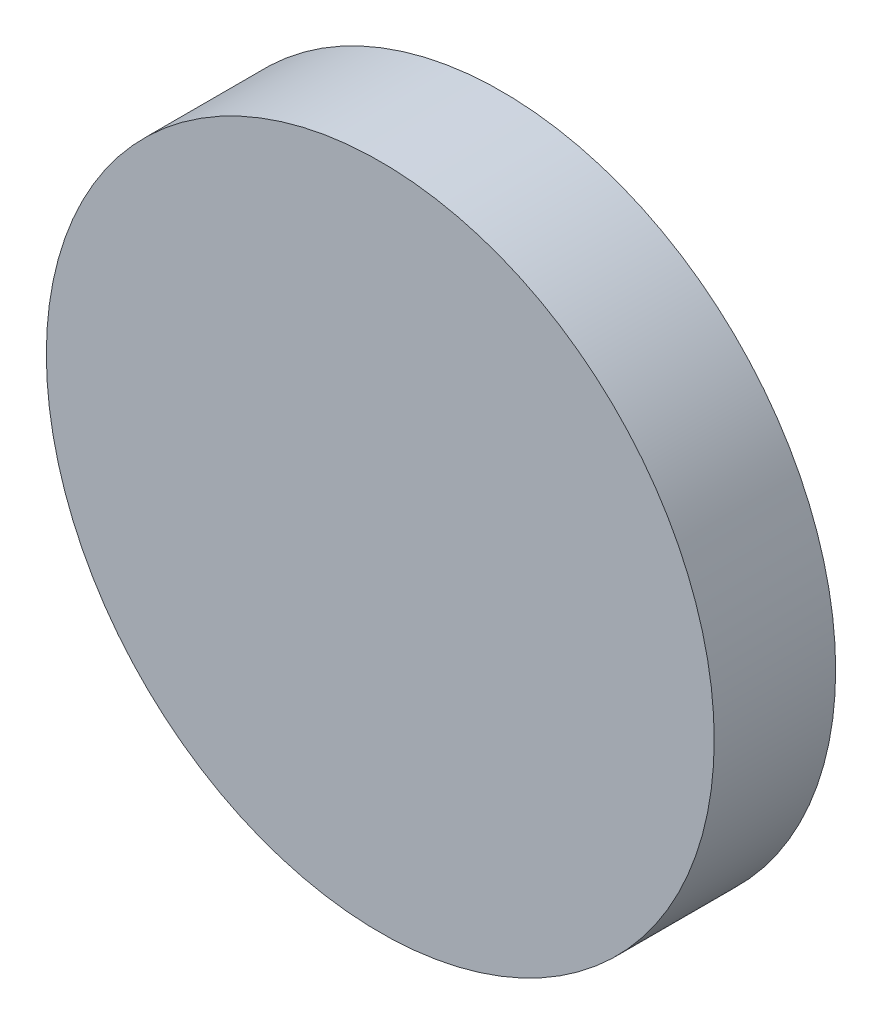
ISO-10303-21;
HEADER;
FILE_DESCRIPTION(('STEP AP214'),'2;1');
FILE_NAME('part.step','',(''),(''),'','','');
FILE_SCHEMA(('AUTOMOTIVE_DESIGN { 1 0 10303 214 1 1 1 1 }'));
ENDSEC;
DATA;
#1=APPLICATION_CONTEXT('core data for automotive mechanical design processes');
#2=APPLICATION_PROTOCOL_DEFINITION('international standard','automotive_design',2000,#1);
#3=PRODUCT_CONTEXT('',#1,'mechanical');
#4=PRODUCT('Part','Part','',(#3));
#5=PRODUCT_RELATED_PRODUCT_CATEGORY('part','',(#4));
#6=PRODUCT_DEFINITION_FORMATION('','',#4);
#7=PRODUCT_DEFINITION_CONTEXT('part definition',#1,'design');
#8=PRODUCT_DEFINITION('design','',#6,#7);
#9=PRODUCT_DEFINITION_SHAPE('','',#8);
#10=(LENGTH_UNIT() NAMED_UNIT(*) SI_UNIT(.MILLI.,.METRE.));
#11=(NAMED_UNIT(*) PLANE_ANGLE_UNIT() SI_UNIT($,.RADIAN.));
#12=(NAMED_UNIT(*) SI_UNIT($,.STERADIAN.) SOLID_ANGLE_UNIT());
#13=UNCERTAINTY_MEASURE_WITH_UNIT(LENGTH_MEASURE(1.E-05),#10,'distance_accuracy_value','');
#14=(GEOMETRIC_REPRESENTATION_CONTEXT(3) GLOBAL_UNCERTAINTY_ASSIGNED_CONTEXT((#13)) GLOBAL_UNIT_ASSIGNED_CONTEXT((#10,
#11,#12)) REPRESENTATION_CONTEXT('',''));
#15=CARTESIAN_POINT('',(0.,0.,0.));
#16=DIRECTION('',(0.,0.,1.));
#17=DIRECTION('',(1.,0.,0.));
#18=AXIS2_PLACEMENT_3D('',#15,#16,#17);
#19=CARTESIAN_POINT('',(0.,0.,1000.));
#20=DIRECTION('',(0.,0.,-1.));
#21=DIRECTION('',(-1.,0.,0.));
#22=AXIS2_PLACEMENT_3D('',#19,#20,#21);
#23=CYLINDRICAL_SURFACE('',#22,5500.);
#24=CARTESIAN_POINT('',(0.,0.,1000.));
#25=DIRECTION('',(0.,0.,1.));
#26=DIRECTION('',(1.,0.,0.));
#27=AXIS2_PLACEMENT_3D('',#24,#25,#26);
#28=CIRCLE('',#27,5500.);
#29=CARTESIAN_POINT('',(5500.,0.,1000.));
#30=VERTEX_POINT('',#29);
#31=EDGE_CURVE('E10',#30,#30,#28,.T.);
#32=ORIENTED_EDGE('',*,*,#31,.F.);
#33=EDGE_LOOP('',(#32));
#34=FACE_BOUND('',#33,.T.);
#35=CARTESIAN_POINT('',(0.,0.,-1000.));
#36=DIRECTION('',(0.,0.,1.));
#37=DIRECTION('',(1.,0.,0.));
#38=AXIS2_PLACEMENT_3D('',#35,#36,#37);
#39=CIRCLE('',#38,5500.);
#40=CARTESIAN_POINT('',(5500.,0.,-1000.));
#41=VERTEX_POINT('',#40);
#42=EDGE_CURVE('E40',#41,#41,#39,.T.);
#43=ORIENTED_EDGE('',*,*,#42,.T.);
#44=EDGE_LOOP('',(#43));
#45=FACE_BOUND('',#44,.T.);
#46=ADVANCED_FACE('F37',(#34,#45),#23,.T.);
#47=CARTESIAN_POINT('',(0.,0.,1000.));
#48=DIRECTION('',(0.,0.,1.));
#49=DIRECTION('',(1.,0.,0.));
#50=AXIS2_PLACEMENT_3D('',#47,#48,#49);
#51=PLANE('',#50);
#52=ORIENTED_EDGE('',*,*,#31,.T.);
#53=EDGE_LOOP('',(#52));
#54=FACE_BOUND('',#53,.T.);
#55=ADVANCED_FACE('F54',(#54),#51,.T.);
#56=CARTESIAN_POINT('',(0.,0.,-1000.));
#57=DIRECTION('',(0.,0.,1.));
#58=DIRECTION('',(1.,0.,0.));
#59=AXIS2_PLACEMENT_3D('',#56,#57,#58);
#60=PLANE('',#59);
#61=ORIENTED_EDGE('',*,*,#42,.F.);
#62=EDGE_LOOP('',(#61));
#63=FACE_BOUND('',#62,.T.);
#64=ADVANCED_FACE('F52',(#63),#60,.F.);
#65=CLOSED_SHELL('',(#46,#55,#64));
#66=MANIFOLD_SOLID_BREP('B2',#65);
#67=ADVANCED_BREP_SHAPE_REPRESENTATION('',(#18,#66),#14);
#68=SHAPE_DEFINITION_REPRESENTATION(#9,#67);
ENDSEC;
END-ISO-10303-21;
